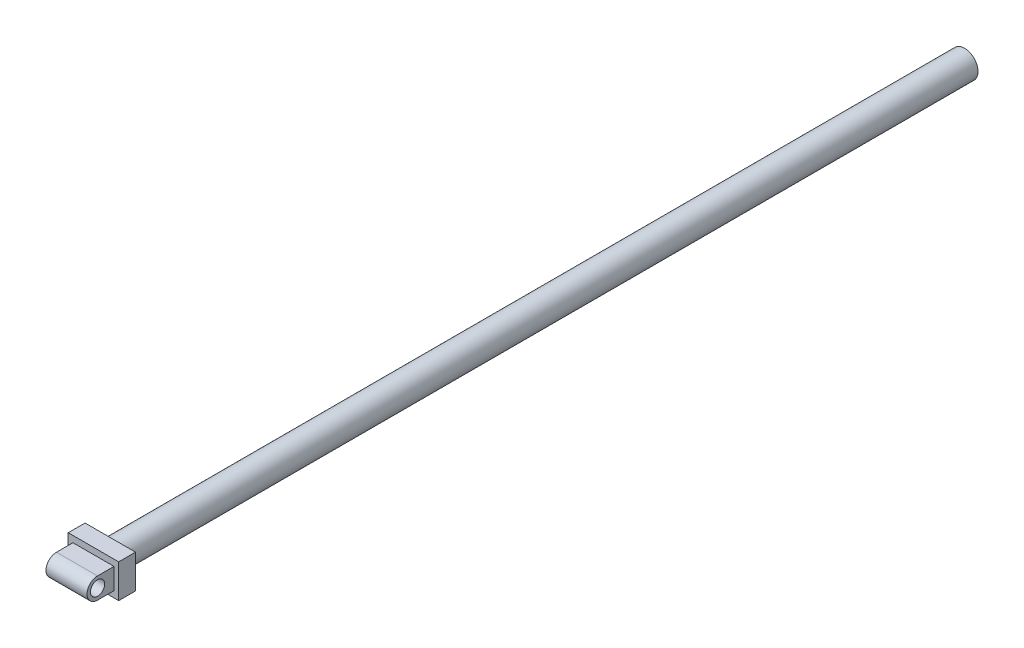
ISO-10303-21;
HEADER;
FILE_DESCRIPTION(('STEP AP214'),'2;1');
FILE_NAME('part.step','',(''),(''),'','','');
FILE_SCHEMA(('AUTOMOTIVE_DESIGN { 1 0 10303 214 1 1 1 1 }'));
ENDSEC;
DATA;
#1=APPLICATION_CONTEXT('core data for automotive mechanical design processes');
#2=APPLICATION_PROTOCOL_DEFINITION('international standard','automotive_design',2000,#1);
#3=PRODUCT_CONTEXT('',#1,'mechanical');
#4=PRODUCT('Part','Part','',(#3));
#5=PRODUCT_RELATED_PRODUCT_CATEGORY('part','',(#4));
#6=PRODUCT_DEFINITION_FORMATION('','',#4);
#7=PRODUCT_DEFINITION_CONTEXT('part definition',#1,'design');
#8=PRODUCT_DEFINITION('design','',#6,#7);
#9=PRODUCT_DEFINITION_SHAPE('','',#8);
#10=(LENGTH_UNIT() NAMED_UNIT(*) SI_UNIT(.MILLI.,.METRE.));
#11=(NAMED_UNIT(*) PLANE_ANGLE_UNIT() SI_UNIT($,.RADIAN.));
#12=(NAMED_UNIT(*) SI_UNIT($,.STERADIAN.) SOLID_ANGLE_UNIT());
#13=UNCERTAINTY_MEASURE_WITH_UNIT(LENGTH_MEASURE(1.E-05),#10,'distance_accuracy_value','');
#14=(GEOMETRIC_REPRESENTATION_CONTEXT(3) GLOBAL_UNCERTAINTY_ASSIGNED_CONTEXT((#13)) GLOBAL_UNIT_ASSIGNED_CONTEXT((#10,
#11,#12)) REPRESENTATION_CONTEXT('',''));
#15=CARTESIAN_POINT('',(0.,0.,0.));
#16=DIRECTION('',(0.,0.,1.));
#17=DIRECTION('',(1.,0.,0.));
#18=AXIS2_PLACEMENT_3D('',#15,#16,#17);
#19=CARTESIAN_POINT('',(6.1,-5.,10.));
#20=DIRECTION('',(-1.,0.,0.));
#21=DIRECTION('',(0.,0.,1.));
#22=AXIS2_PLACEMENT_3D('',#19,#20,#21);
#23=PLANE('',#22);
#24=CARTESIAN_POINT('',(6.1,0.,4.88920529577044));
#25=DIRECTION('',(-1.,0.,0.));
#26=DIRECTION('',(0.,0.,1.));
#27=AXIS2_PLACEMENT_3D('',#24,#25,#26);
#28=CIRCLE('',#27,2.125);
#29=CARTESIAN_POINT('',(6.1,0.,7.01420529577044));
#30=VERTEX_POINT('',#29);
#31=EDGE_CURVE('E109',#30,#30,#28,.T.);
#32=ORIENTED_EDGE('',*,*,#31,.T.);
#33=EDGE_LOOP('',(#32));
#34=FACE_BOUND('',#33,.T.);
#35=DIRECTION('',(0.,1.,0.));
#36=VECTOR('',#35,1.);
#37=CARTESIAN_POINT('',(6.1,-5.,0.));
#38=LINE('',#37,#36);
#39=CARTESIAN_POINT('',(6.1,-3.125,0.));
#40=VERTEX_POINT('',#39);
#41=CARTESIAN_POINT('',(6.1,3.125,0.));
#42=VERTEX_POINT('',#41);
#43=EDGE_CURVE('E113',#40,#42,#38,.T.);
#44=ORIENTED_EDGE('',*,*,#43,.T.);
#45=DIRECTION('',(0.,0.,1.));
#46=VECTOR('',#45,1.);
#47=CARTESIAN_POINT('',(6.1,3.125,4.88920529577044));
#48=LINE('',#47,#46);
#49=CARTESIAN_POINT('',(6.1,3.125,4.88920529577044));
#50=VERTEX_POINT('',#49);
#51=EDGE_CURVE('E89',#42,#50,#48,.T.);
#52=ORIENTED_EDGE('',*,*,#51,.T.);
#53=CARTESIAN_POINT('',(6.1,0.,4.88920529577044));
#54=DIRECTION('',(1.,0.,0.));
#55=DIRECTION('',(0.,0.,1.));
#56=AXIS2_PLACEMENT_3D('',#53,#54,#55);
#57=CIRCLE('',#56,3.125);
#58=CARTESIAN_POINT('',(6.1,-3.125,4.88920529577044));
#59=VERTEX_POINT('',#58);
#60=EDGE_CURVE('E83',#50,#59,#57,.T.);
#61=ORIENTED_EDGE('',*,*,#60,.T.);
#62=DIRECTION('',(0.,0.,-1.));
#63=VECTOR('',#62,1.);
#64=CARTESIAN_POINT('',(6.1,-3.125,0.));
#65=LINE('',#64,#63);
#66=EDGE_CURVE('E92',#59,#40,#65,.T.);
#67=ORIENTED_EDGE('',*,*,#66,.T.);
#68=EDGE_LOOP('',(#44,#52,#61,#67));
#69=FACE_BOUND('',#68,.T.);
#70=ADVANCED_FACE('F45',(#34,#69),#23,.F.);
#71=CARTESIAN_POINT('',(-6.1,-5.,10.));
#72=DIRECTION('',(1.,0.,0.));
#73=DIRECTION('',(0.,0.,-1.));
#74=AXIS2_PLACEMENT_3D('',#71,#72,#73);
#75=PLANE('',#74);
#76=CARTESIAN_POINT('',(-6.1,0.,4.88920529577044));
#77=DIRECTION('',(-1.,0.,0.));
#78=DIRECTION('',(0.,0.,1.));
#79=AXIS2_PLACEMENT_3D('',#76,#77,#78);
#80=CIRCLE('',#79,2.125);
#81=CARTESIAN_POINT('',(-6.1,0.,7.01420529577044));
#82=VERTEX_POINT('',#81);
#83=EDGE_CURVE('E114',#82,#82,#80,.T.);
#84=ORIENTED_EDGE('',*,*,#83,.F.);
#85=EDGE_LOOP('',(#84));
#86=FACE_BOUND('',#85,.T.);
#87=CARTESIAN_POINT('',(-6.1,0.,4.88920529577044));
#88=DIRECTION('',(1.,0.,0.));
#89=DIRECTION('',(0.,0.,1.));
#90=AXIS2_PLACEMENT_3D('',#87,#88,#89);
#91=CIRCLE('',#90,3.125);
#92=CARTESIAN_POINT('',(-6.1,3.125,4.88920529577044));
#93=VERTEX_POINT('',#92);
#94=CARTESIAN_POINT('',(-6.1,-3.125,4.88920529577044));
#95=VERTEX_POINT('',#94);
#96=EDGE_CURVE('E86',#93,#95,#91,.T.);
#97=ORIENTED_EDGE('',*,*,#96,.F.);
#98=DIRECTION('',(0.,0.,1.));
#99=VECTOR('',#98,1.);
#100=CARTESIAN_POINT('',(-6.1,3.125,4.88920529577044));
#101=LINE('',#100,#99);
#102=CARTESIAN_POINT('',(-6.1,3.125,0.));
#103=VERTEX_POINT('',#102);
#104=EDGE_CURVE('E101',#103,#93,#101,.T.);
#105=ORIENTED_EDGE('',*,*,#104,.F.);
#106=DIRECTION('',(0.,-1.,0.));
#107=VECTOR('',#106,1.);
#108=CARTESIAN_POINT('',(-6.1,-5.,0.));
#109=LINE('',#108,#107);
#110=CARTESIAN_POINT('',(-6.1,-3.125,0.));
#111=VERTEX_POINT('',#110);
#112=EDGE_CURVE('E48',#103,#111,#109,.T.);
#113=ORIENTED_EDGE('',*,*,#112,.T.);
#114=DIRECTION('',(0.,0.,-1.));
#115=VECTOR('',#114,1.);
#116=CARTESIAN_POINT('',(-6.1,-3.125,0.));
#117=LINE('',#116,#115);
#118=EDGE_CURVE('E105',#95,#111,#117,.T.);
#119=ORIENTED_EDGE('',*,*,#118,.F.);
#120=EDGE_LOOP('',(#97,#105,#113,#119));
#121=FACE_BOUND('',#120,.T.);
#122=ADVANCED_FACE('F122',(#86,#121),#75,.F.);
#123=CARTESIAN_POINT('',(6.1,0.,4.88920529577044));
#124=DIRECTION('',(-1.,0.,0.));
#125=DIRECTION('',(0.,0.,1.));
#126=AXIS2_PLACEMENT_3D('',#123,#124,#125);
#127=CYLINDRICAL_SURFACE('',#126,3.125);
#128=ORIENTED_EDGE('',*,*,#96,.T.);
#129=DIRECTION('',(-1.,0.,0.));
#130=VECTOR('',#129,1.);
#131=CARTESIAN_POINT('',(6.1,-3.125,4.88920529577044));
#132=LINE('',#131,#130);
#133=EDGE_CURVE('E69',#59,#95,#132,.T.);
#134=ORIENTED_EDGE('',*,*,#133,.F.);
#135=ORIENTED_EDGE('',*,*,#60,.F.);
#136=DIRECTION('',(-1.,0.,0.));
#137=VECTOR('',#136,1.);
#138=CARTESIAN_POINT('',(6.1,3.125,4.88920529577044));
#139=LINE('',#138,#137);
#140=EDGE_CURVE('E133',#50,#93,#139,.T.);
#141=ORIENTED_EDGE('',*,*,#140,.T.);
#142=EDGE_LOOP('',(#128,#134,#135,#141));
#143=FACE_BOUND('',#142,.T.);
#144=ADVANCED_FACE('F81',(#143),#127,.T.);
#145=CARTESIAN_POINT('',(6.1,3.125,4.88920529577044));
#146=DIRECTION('',(0.,-1.,0.));
#147=DIRECTION('',(0.,0.,-1.));
#148=AXIS2_PLACEMENT_3D('',#145,#146,#147);
#149=PLANE('',#148);
#150=ORIENTED_EDGE('',*,*,#104,.T.);
#151=ORIENTED_EDGE('',*,*,#140,.F.);
#152=ORIENTED_EDGE('',*,*,#51,.F.);
#153=DIRECTION('',(-1.,0.,0.));
#154=VECTOR('',#153,1.);
#155=CARTESIAN_POINT('',(6.1,3.125,0.));
#156=LINE('',#155,#154);
#157=EDGE_CURVE('E127',#42,#103,#156,.T.);
#158=ORIENTED_EDGE('',*,*,#157,.T.);
#159=EDGE_LOOP('',(#150,#151,#152,#158));
#160=FACE_BOUND('',#159,.T.);
#161=ADVANCED_FACE('F131',(#160),#149,.F.);
#162=CARTESIAN_POINT('',(6.1,-3.125,0.));
#163=DIRECTION('',(0.,1.,0.));
#164=DIRECTION('',(0.,0.,1.));
#165=AXIS2_PLACEMENT_3D('',#162,#163,#164);
#166=PLANE('',#165);
#167=ORIENTED_EDGE('',*,*,#118,.T.);
#168=DIRECTION('',(-1.,0.,0.));
#169=VECTOR('',#168,1.);
#170=CARTESIAN_POINT('',(6.1,-3.125,0.));
#171=LINE('',#170,#169);
#172=EDGE_CURVE('E61',#40,#111,#171,.T.);
#173=ORIENTED_EDGE('',*,*,#172,.F.);
#174=ORIENTED_EDGE('',*,*,#66,.F.);
#175=ORIENTED_EDGE('',*,*,#133,.T.);
#176=EDGE_LOOP('',(#167,#173,#174,#175));
#177=FACE_BOUND('',#176,.T.);
#178=ADVANCED_FACE('F93',(#177),#166,.F.);
#179=CARTESIAN_POINT('',(6.1,0.,4.88920529577044));
#180=DIRECTION('',(-1.,0.,0.));
#181=DIRECTION('',(0.,0.,1.));
#182=AXIS2_PLACEMENT_3D('',#179,#180,#181);
#183=CYLINDRICAL_SURFACE('',#182,2.125);
#184=ORIENTED_EDGE('',*,*,#31,.F.);
#185=EDGE_LOOP('',(#184));
#186=FACE_BOUND('',#185,.T.);
#187=ORIENTED_EDGE('',*,*,#83,.T.);
#188=EDGE_LOOP('',(#187));
#189=FACE_BOUND('',#188,.T.);
#190=ADVANCED_FACE('F243',(#186,#189),#183,.F.);
#191=CARTESIAN_POINT('',(0.,0.,0.));
#192=DIRECTION('',(0.,0.,1.));
#193=DIRECTION('',(1.,0.,0.));
#194=AXIS2_PLACEMENT_3D('',#191,#192,#193);
#195=PLANE('',#194);
#196=DIRECTION('',(0.,1.,0.));
#197=VECTOR('',#196,1.);
#198=CARTESIAN_POINT('',(-7.5,-5.,0.));
#199=LINE('',#198,#197);
#200=CARTESIAN_POINT('',(-7.5,-5.,0.));
#201=VERTEX_POINT('',#200);
#202=CARTESIAN_POINT('',(-7.5,5.,0.));
#203=VERTEX_POINT('',#202);
#204=EDGE_CURVE('E175',#201,#203,#199,.T.);
#205=ORIENTED_EDGE('',*,*,#204,.F.);
#206=DIRECTION('',(-1.,0.,0.));
#207=VECTOR('',#206,1.);
#208=CARTESIAN_POINT('',(7.5,-5.,0.));
#209=LINE('',#208,#207);
#210=CARTESIAN_POINT('',(7.5,-5.,0.));
#211=VERTEX_POINT('',#210);
#212=EDGE_CURVE('E162',#211,#201,#209,.T.);
#213=ORIENTED_EDGE('',*,*,#212,.F.);
#214=DIRECTION('',(0.,-1.,0.));
#215=VECTOR('',#214,1.);
#216=CARTESIAN_POINT('',(7.5,-5.,0.));
#217=LINE('',#216,#215);
#218=CARTESIAN_POINT('',(7.5,5.,0.));
#219=VERTEX_POINT('',#218);
#220=EDGE_CURVE('E167',#219,#211,#217,.T.);
#221=ORIENTED_EDGE('',*,*,#220,.F.);
#222=DIRECTION('',(1.,0.,0.));
#223=VECTOR('',#222,1.);
#224=CARTESIAN_POINT('',(7.5,5.,0.));
#225=LINE('',#224,#223);
#226=EDGE_CURVE('E171',#203,#219,#225,.T.);
#227=ORIENTED_EDGE('',*,*,#226,.F.);
#228=EDGE_LOOP('',(#205,#213,#221,#227));
#229=FACE_BOUND('',#228,.T.);
#230=ORIENTED_EDGE('',*,*,#157,.F.);
#231=ORIENTED_EDGE('',*,*,#43,.F.);
#232=ORIENTED_EDGE('',*,*,#172,.T.);
#233=ORIENTED_EDGE('',*,*,#112,.F.);
#234=EDGE_LOOP('',(#230,#231,#232,#233));
#235=FACE_BOUND('',#234,.T.);
#236=ADVANCED_FACE('F126',(#229,#235),#195,.T.);
#237=CARTESIAN_POINT('',(-7.5,-5.,-5.));
#238=DIRECTION('',(1.,0.,0.));
#239=DIRECTION('',(0.,0.,-1.));
#240=AXIS2_PLACEMENT_3D('',#237,#238,#239);
#241=PLANE('',#240);
#242=ORIENTED_EDGE('',*,*,#204,.T.);
#243=DIRECTION('',(0.,0.,1.));
#244=VECTOR('',#243,1.);
#245=CARTESIAN_POINT('',(-7.5,5.,-5.));
#246=LINE('',#245,#244);
#247=CARTESIAN_POINT('',(-7.5,5.,-5.));
#248=VERTEX_POINT('',#247);
#249=EDGE_CURVE('E138',#248,#203,#246,.T.);
#250=ORIENTED_EDGE('',*,*,#249,.F.);
#251=DIRECTION('',(0.,1.,0.));
#252=VECTOR('',#251,1.);
#253=CARTESIAN_POINT('',(-7.5,-5.,-5.));
#254=LINE('',#253,#252);
#255=CARTESIAN_POINT('',(-7.5,-5.,-5.));
#256=VERTEX_POINT('',#255);
#257=EDGE_CURVE('E166',#256,#248,#254,.T.);
#258=ORIENTED_EDGE('',*,*,#257,.F.);
#259=DIRECTION('',(0.,0.,1.));
#260=VECTOR('',#259,1.);
#261=CARTESIAN_POINT('',(-7.5,-5.,-5.));
#262=LINE('',#261,#260);
#263=EDGE_CURVE('E157',#256,#201,#262,.T.);
#264=ORIENTED_EDGE('',*,*,#263,.T.);
#265=EDGE_LOOP('',(#242,#250,#258,#264));
#266=FACE_BOUND('',#265,.T.);
#267=ADVANCED_FACE('F222',(#266),#241,.F.);
#268=CARTESIAN_POINT('',(7.5,5.,-5.));
#269=DIRECTION('',(0.,-1.,0.));
#270=DIRECTION('',(0.,0.,-1.));
#271=AXIS2_PLACEMENT_3D('',#268,#269,#270);
#272=PLANE('',#271);
#273=ORIENTED_EDGE('',*,*,#226,.T.);
#274=DIRECTION('',(0.,0.,1.));
#275=VECTOR('',#274,1.);
#276=CARTESIAN_POINT('',(7.5,5.,-5.));
#277=LINE('',#276,#275);
#278=CARTESIAN_POINT('',(7.5,5.,-5.));
#279=VERTEX_POINT('',#278);
#280=EDGE_CURVE('E149',#279,#219,#277,.T.);
#281=ORIENTED_EDGE('',*,*,#280,.F.);
#282=DIRECTION('',(1.,0.,0.));
#283=VECTOR('',#282,1.);
#284=CARTESIAN_POINT('',(7.5,5.,-5.));
#285=LINE('',#284,#283);
#286=EDGE_CURVE('E187',#248,#279,#285,.T.);
#287=ORIENTED_EDGE('',*,*,#286,.F.);
#288=ORIENTED_EDGE('',*,*,#249,.T.);
#289=EDGE_LOOP('',(#273,#281,#287,#288));
#290=FACE_BOUND('',#289,.T.);
#291=ADVANCED_FACE('F226',(#290),#272,.F.);
#292=CARTESIAN_POINT('',(7.5,-5.,-5.));
#293=DIRECTION('',(-1.,0.,0.));
#294=DIRECTION('',(0.,0.,1.));
#295=AXIS2_PLACEMENT_3D('',#292,#293,#294);
#296=PLANE('',#295);
#297=ORIENTED_EDGE('',*,*,#220,.T.);
#298=DIRECTION('',(0.,0.,1.));
#299=VECTOR('',#298,1.);
#300=CARTESIAN_POINT('',(7.5,-5.,-5.));
#301=LINE('',#300,#299);
#302=CARTESIAN_POINT('',(7.5,-5.,-5.));
#303=VERTEX_POINT('',#302);
#304=EDGE_CURVE('E153',#303,#211,#301,.T.);
#305=ORIENTED_EDGE('',*,*,#304,.F.);
#306=DIRECTION('',(0.,-1.,0.));
#307=VECTOR('',#306,1.);
#308=CARTESIAN_POINT('',(7.5,-5.,-5.));
#309=LINE('',#308,#307);
#310=EDGE_CURVE('E183',#279,#303,#309,.T.);
#311=ORIENTED_EDGE('',*,*,#310,.F.);
#312=ORIENTED_EDGE('',*,*,#280,.T.);
#313=EDGE_LOOP('',(#297,#305,#311,#312));
#314=FACE_BOUND('',#313,.T.);
#315=ADVANCED_FACE('F273',(#314),#296,.F.);
#316=CARTESIAN_POINT('',(7.5,-5.,-5.));
#317=DIRECTION('',(0.,1.,0.));
#318=DIRECTION('',(0.,0.,1.));
#319=AXIS2_PLACEMENT_3D('',#316,#317,#318);
#320=PLANE('',#319);
#321=ORIENTED_EDGE('',*,*,#212,.T.);
#322=ORIENTED_EDGE('',*,*,#263,.F.);
#323=DIRECTION('',(-1.,0.,0.));
#324=VECTOR('',#323,1.);
#325=CARTESIAN_POINT('',(7.5,-5.,-5.));
#326=LINE('',#325,#324);
#327=EDGE_CURVE('E161',#303,#256,#326,.T.);
#328=ORIENTED_EDGE('',*,*,#327,.F.);
#329=ORIENTED_EDGE('',*,*,#304,.T.);
#330=EDGE_LOOP('',(#321,#322,#328,#329));
#331=FACE_BOUND('',#330,.T.);
#332=ADVANCED_FACE('F209',(#331),#320,.F.);
#333=CARTESIAN_POINT('',(0.,0.,-5.));
#334=DIRECTION('',(0.,0.,1.));
#335=DIRECTION('',(1.,0.,0.));
#336=AXIS2_PLACEMENT_3D('',#333,#334,#335);
#337=PLANE('',#336);
#338=CARTESIAN_POINT('',(0.,0.,-5.));
#339=DIRECTION('',(0.,0.,-1.));
#340=DIRECTION('',(-1.,0.,0.));
#341=AXIS2_PLACEMENT_3D('',#338,#339,#340);
#342=CIRCLE('',#341,4.);
#343=CARTESIAN_POINT('',(-4.,0.,-5.));
#344=VERTEX_POINT('',#343);
#345=EDGE_CURVE('E11',#344,#344,#342,.T.);
#346=ORIENTED_EDGE('',*,*,#345,.F.);
#347=EDGE_LOOP('',(#346));
#348=FACE_BOUND('',#347,.T.);
#349=ORIENTED_EDGE('',*,*,#257,.T.);
#350=ORIENTED_EDGE('',*,*,#286,.T.);
#351=ORIENTED_EDGE('',*,*,#310,.T.);
#352=ORIENTED_EDGE('',*,*,#327,.T.);
#353=EDGE_LOOP('',(#349,#350,#351,#352));
#354=FACE_BOUND('',#353,.T.);
#355=ADVANCED_FACE('F203',(#348,#354),#337,.F.);
#356=CARTESIAN_POINT('',(0.,0.,-259.));
#357=DIRECTION('',(0.,0.,1.));
#358=DIRECTION('',(1.,0.,0.));
#359=AXIS2_PLACEMENT_3D('',#356,#357,#358);
#360=CYLINDRICAL_SURFACE('',#359,4.);
#361=CARTESIAN_POINT('',(0.,0.,-259.));
#362=DIRECTION('',(0.,0.,-1.));
#363=DIRECTION('',(-1.,0.,0.));
#364=AXIS2_PLACEMENT_3D('',#361,#362,#363);
#365=CIRCLE('',#364,4.);
#366=CARTESIAN_POINT('',(-4.,0.,-259.));
#367=VERTEX_POINT('',#366);
#368=EDGE_CURVE('E179',#367,#367,#365,.T.);
#369=ORIENTED_EDGE('',*,*,#368,.F.);
#370=EDGE_LOOP('',(#369));
#371=FACE_BOUND('',#370,.T.);
#372=ORIENTED_EDGE('',*,*,#345,.T.);
#373=EDGE_LOOP('',(#372));
#374=FACE_BOUND('',#373,.T.);
#375=ADVANCED_FACE('F200',(#371,#374),#360,.T.);
#376=CARTESIAN_POINT('',(0.,0.,-259.));
#377=DIRECTION('',(0.,0.,-1.));
#378=DIRECTION('',(-1.,0.,0.));
#379=AXIS2_PLACEMENT_3D('',#376,#377,#378);
#380=PLANE('',#379);
#381=ORIENTED_EDGE('',*,*,#368,.T.);
#382=EDGE_LOOP('',(#381));
#383=FACE_BOUND('',#382,.T.);
#384=ADVANCED_FACE('F198',(#383),#380,.T.);
#385=CLOSED_SHELL('',(#70,#122,#144,#161,#178,#190,#236,#267,#291,#315,#332,#355,#375,#384));
#386=MANIFOLD_SOLID_BREP('B2',#385);
#387=ADVANCED_BREP_SHAPE_REPRESENTATION('',(#18,#386),#14);
#388=SHAPE_DEFINITION_REPRESENTATION(#9,#387);
ENDSEC;
END-ISO-10303-21;
